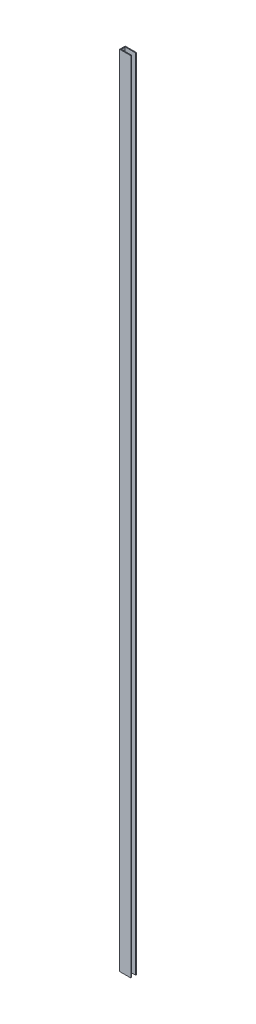
ISO-10303-21;
HEADER;
FILE_DESCRIPTION(('STEP AP214'),'2;1');
FILE_NAME('part.step','',(''),(''),'','','');
FILE_SCHEMA(('AUTOMOTIVE_DESIGN { 1 0 10303 214 1 1 1 1 }'));
ENDSEC;
DATA;
#1=APPLICATION_CONTEXT('core data for automotive mechanical design processes');
#2=APPLICATION_PROTOCOL_DEFINITION('international standard','automotive_design',2000,#1);
#3=PRODUCT_CONTEXT('',#1,'mechanical');
#4=PRODUCT('Part','Part','',(#3));
#5=PRODUCT_RELATED_PRODUCT_CATEGORY('part','',(#4));
#6=PRODUCT_DEFINITION_FORMATION('','',#4);
#7=PRODUCT_DEFINITION_CONTEXT('part definition',#1,'design');
#8=PRODUCT_DEFINITION('design','',#6,#7);
#9=PRODUCT_DEFINITION_SHAPE('','',#8);
#10=(LENGTH_UNIT() NAMED_UNIT(*) SI_UNIT(.MILLI.,.METRE.));
#11=(NAMED_UNIT(*) PLANE_ANGLE_UNIT() SI_UNIT($,.RADIAN.));
#12=(NAMED_UNIT(*) SI_UNIT($,.STERADIAN.) SOLID_ANGLE_UNIT());
#13=UNCERTAINTY_MEASURE_WITH_UNIT(LENGTH_MEASURE(1.E-05),#10,'distance_accuracy_value','');
#14=(GEOMETRIC_REPRESENTATION_CONTEXT(3) GLOBAL_UNCERTAINTY_ASSIGNED_CONTEXT((#13)) GLOBAL_UNIT_ASSIGNED_CONTEXT((#10,
#11,#12)) REPRESENTATION_CONTEXT('',''));
#15=CARTESIAN_POINT('',(0.,0.,0.));
#16=DIRECTION('',(0.,0.,1.));
#17=DIRECTION('',(1.,0.,0.));
#18=AXIS2_PLACEMENT_3D('',#15,#16,#17);
#19=CARTESIAN_POINT('',(0.,2000.,7.00000000000001));
#20=DIRECTION('',(-1.,0.,0.));
#21=DIRECTION('',(0.,0.,1.));
#22=AXIS2_PLACEMENT_3D('',#19,#20,#21);
#23=PLANE('',#22);
#24=DIRECTION('',(0.,0.,-1.));
#25=VECTOR('',#24,1.);
#26=CARTESIAN_POINT('',(0.,0.,7.00000000000001));
#27=LINE('',#26,#25);
#28=CARTESIAN_POINT('',(0.,0.,7.00000000000001));
#29=VERTEX_POINT('',#28);
#30=CARTESIAN_POINT('',(0.,0.,-7.00000000000001));
#31=VERTEX_POINT('',#30);
#32=EDGE_CURVE('E132',#29,#31,#27,.T.);
#33=ORIENTED_EDGE('',*,*,#32,.F.);
#34=DIRECTION('',(0.,-1.,0.));
#35=VECTOR('',#34,1.);
#36=CARTESIAN_POINT('',(0.,2000.,7.00000000000001));
#37=LINE('',#36,#35);
#38=CARTESIAN_POINT('',(0.,2000.,7.00000000000001));
#39=VERTEX_POINT('',#38);
#40=EDGE_CURVE('E11',#39,#29,#37,.T.);
#41=ORIENTED_EDGE('',*,*,#40,.F.);
#42=DIRECTION('',(0.,0.,-1.));
#43=VECTOR('',#42,1.);
#44=CARTESIAN_POINT('',(0.,2000.,7.00000000000001));
#45=LINE('',#44,#43);
#46=CARTESIAN_POINT('',(0.,2000.,-7.00000000000001));
#47=VERTEX_POINT('',#46);
#48=EDGE_CURVE('E152',#39,#47,#45,.T.);
#49=ORIENTED_EDGE('',*,*,#48,.T.);
#50=DIRECTION('',(0.,-1.,0.));
#51=VECTOR('',#50,1.);
#52=CARTESIAN_POINT('',(0.,2000.,-7.00000000000001));
#53=LINE('',#52,#51);
#54=EDGE_CURVE('E38',#47,#31,#53,.T.);
#55=ORIENTED_EDGE('',*,*,#54,.T.);
#56=EDGE_LOOP('',(#33,#41,#49,#55));
#57=FACE_BOUND('',#56,.T.);
#58=ADVANCED_FACE('F35',(#57),#23,.T.);
#59=CARTESIAN_POINT('',(28.,2000.,7.));
#60=DIRECTION('',(0.,0.,1.));
#61=DIRECTION('',(1.,0.,0.));
#62=AXIS2_PLACEMENT_3D('',#59,#60,#61);
#63=PLANE('',#62);
#64=DIRECTION('',(-1.,0.,0.));
#65=VECTOR('',#64,1.);
#66=CARTESIAN_POINT('',(28.,0.,7.));
#67=LINE('',#66,#65);
#68=CARTESIAN_POINT('',(28.,0.,7.));
#69=VERTEX_POINT('',#68);
#70=EDGE_CURVE('E150',#69,#29,#67,.T.);
#71=ORIENTED_EDGE('',*,*,#70,.F.);
#72=DIRECTION('',(0.,-1.,0.));
#73=VECTOR('',#72,1.);
#74=CARTESIAN_POINT('',(28.,2000.,7.));
#75=LINE('',#74,#73);
#76=CARTESIAN_POINT('',(28.,2000.,7.));
#77=VERTEX_POINT('',#76);
#78=EDGE_CURVE('E44',#77,#69,#75,.T.);
#79=ORIENTED_EDGE('',*,*,#78,.F.);
#80=DIRECTION('',(-1.,0.,0.));
#81=VECTOR('',#80,1.);
#82=CARTESIAN_POINT('',(28.,2000.,7.));
#83=LINE('',#82,#81);
#84=EDGE_CURVE('E122',#77,#39,#83,.T.);
#85=ORIENTED_EDGE('',*,*,#84,.T.);
#86=ORIENTED_EDGE('',*,*,#40,.T.);
#87=EDGE_LOOP('',(#71,#79,#85,#86));
#88=FACE_BOUND('',#87,.T.);
#89=ADVANCED_FACE('F164',(#88),#63,.T.);
#90=CARTESIAN_POINT('',(28.,2000.,5.));
#91=DIRECTION('',(1.,0.,0.));
#92=DIRECTION('',(0.,0.,-1.));
#93=AXIS2_PLACEMENT_3D('',#90,#91,#92);
#94=PLANE('',#93);
#95=DIRECTION('',(0.,0.,1.));
#96=VECTOR('',#95,1.);
#97=CARTESIAN_POINT('',(28.,0.,5.));
#98=LINE('',#97,#96);
#99=CARTESIAN_POINT('',(28.,0.,5.));
#100=VERTEX_POINT('',#99);
#101=EDGE_CURVE('E109',#100,#69,#98,.T.);
#102=ORIENTED_EDGE('',*,*,#101,.F.);
#103=DIRECTION('',(0.,-1.,0.));
#104=VECTOR('',#103,1.);
#105=CARTESIAN_POINT('',(28.,2000.,5.));
#106=LINE('',#105,#104);
#107=CARTESIAN_POINT('',(28.,2000.,5.));
#108=VERTEX_POINT('',#107);
#109=EDGE_CURVE('E104',#108,#100,#106,.T.);
#110=ORIENTED_EDGE('',*,*,#109,.F.);
#111=DIRECTION('',(0.,0.,1.));
#112=VECTOR('',#111,1.);
#113=CARTESIAN_POINT('',(28.,2000.,5.));
#114=LINE('',#113,#112);
#115=EDGE_CURVE('E107',#108,#77,#114,.T.);
#116=ORIENTED_EDGE('',*,*,#115,.T.);
#117=ORIENTED_EDGE('',*,*,#78,.T.);
#118=EDGE_LOOP('',(#102,#110,#116,#117));
#119=FACE_BOUND('',#118,.T.);
#120=ADVANCED_FACE('F106',(#119),#94,.T.);
#121=CARTESIAN_POINT('',(2.,2000.,5.));
#122=DIRECTION('',(0.,0.,-1.));
#123=DIRECTION('',(-1.,0.,0.));
#124=AXIS2_PLACEMENT_3D('',#121,#122,#123);
#125=PLANE('',#124);
#126=DIRECTION('',(1.,0.,0.));
#127=VECTOR('',#126,1.);
#128=CARTESIAN_POINT('',(2.,0.,5.));
#129=LINE('',#128,#127);
#130=CARTESIAN_POINT('',(2.,0.,5.));
#131=VERTEX_POINT('',#130);
#132=EDGE_CURVE('E147',#131,#100,#129,.T.);
#133=ORIENTED_EDGE('',*,*,#132,.F.);
#134=DIRECTION('',(0.,-1.,0.));
#135=VECTOR('',#134,1.);
#136=CARTESIAN_POINT('',(2.,2000.,5.));
#137=LINE('',#136,#135);
#138=CARTESIAN_POINT('',(2.,2000.,5.));
#139=VERTEX_POINT('',#138);
#140=EDGE_CURVE('E114',#139,#131,#137,.T.);
#141=ORIENTED_EDGE('',*,*,#140,.F.);
#142=DIRECTION('',(1.,0.,0.));
#143=VECTOR('',#142,1.);
#144=CARTESIAN_POINT('',(2.,2000.,5.));
#145=LINE('',#144,#143);
#146=EDGE_CURVE('E120',#139,#108,#145,.T.);
#147=ORIENTED_EDGE('',*,*,#146,.T.);
#148=ORIENTED_EDGE('',*,*,#109,.T.);
#149=EDGE_LOOP('',(#133,#141,#147,#148));
#150=FACE_BOUND('',#149,.T.);
#151=ADVANCED_FACE('F124',(#150),#125,.T.);
#152=CARTESIAN_POINT('',(2.,2000.,-5.));
#153=DIRECTION('',(1.,0.,0.));
#154=DIRECTION('',(0.,0.,-1.));
#155=AXIS2_PLACEMENT_3D('',#152,#153,#154);
#156=PLANE('',#155);
#157=DIRECTION('',(0.,0.,1.));
#158=VECTOR('',#157,1.);
#159=CARTESIAN_POINT('',(2.,0.,-5.));
#160=LINE('',#159,#158);
#161=CARTESIAN_POINT('',(2.,0.,-5.));
#162=VERTEX_POINT('',#161);
#163=EDGE_CURVE('E144',#162,#131,#160,.T.);
#164=ORIENTED_EDGE('',*,*,#163,.F.);
#165=DIRECTION('',(0.,-1.,0.));
#166=VECTOR('',#165,1.);
#167=CARTESIAN_POINT('',(2.,2000.,-5.));
#168=LINE('',#167,#166);
#169=CARTESIAN_POINT('',(2.,2000.,-5.));
#170=VERTEX_POINT('',#169);
#171=EDGE_CURVE('E156',#170,#162,#168,.T.);
#172=ORIENTED_EDGE('',*,*,#171,.F.);
#173=DIRECTION('',(0.,0.,1.));
#174=VECTOR('',#173,1.);
#175=CARTESIAN_POINT('',(2.,2000.,-5.));
#176=LINE('',#175,#174);
#177=EDGE_CURVE('E125',#170,#139,#176,.T.);
#178=ORIENTED_EDGE('',*,*,#177,.T.);
#179=ORIENTED_EDGE('',*,*,#140,.T.);
#180=EDGE_LOOP('',(#164,#172,#178,#179));
#181=FACE_BOUND('',#180,.T.);
#182=ADVANCED_FACE('F177',(#181),#156,.T.);
#183=CARTESIAN_POINT('',(28.,2000.,-5.));
#184=DIRECTION('',(0.,0.,1.));
#185=DIRECTION('',(1.,0.,0.));
#186=AXIS2_PLACEMENT_3D('',#183,#184,#185);
#187=PLANE('',#186);
#188=DIRECTION('',(-1.,0.,0.));
#189=VECTOR('',#188,1.);
#190=CARTESIAN_POINT('',(28.,0.,-5.));
#191=LINE('',#190,#189);
#192=CARTESIAN_POINT('',(28.,0.,-5.));
#193=VERTEX_POINT('',#192);
#194=EDGE_CURVE('E141',#193,#162,#191,.T.);
#195=ORIENTED_EDGE('',*,*,#194,.F.);
#196=DIRECTION('',(0.,-1.,0.));
#197=VECTOR('',#196,1.);
#198=CARTESIAN_POINT('',(28.,2000.,-5.));
#199=LINE('',#198,#197);
#200=CARTESIAN_POINT('',(28.,2000.,-5.));
#201=VERTEX_POINT('',#200);
#202=EDGE_CURVE('E158',#201,#193,#199,.T.);
#203=ORIENTED_EDGE('',*,*,#202,.F.);
#204=DIRECTION('',(-1.,0.,0.));
#205=VECTOR('',#204,1.);
#206=CARTESIAN_POINT('',(28.,2000.,-5.));
#207=LINE('',#206,#205);
#208=EDGE_CURVE('E127',#201,#170,#207,.T.);
#209=ORIENTED_EDGE('',*,*,#208,.T.);
#210=ORIENTED_EDGE('',*,*,#171,.T.);
#211=EDGE_LOOP('',(#195,#203,#209,#210));
#212=FACE_BOUND('',#211,.T.);
#213=ADVANCED_FACE('F180',(#212),#187,.T.);
#214=CARTESIAN_POINT('',(28.,2000.,-7.));
#215=DIRECTION('',(1.,0.,0.));
#216=DIRECTION('',(0.,0.,-1.));
#217=AXIS2_PLACEMENT_3D('',#214,#215,#216);
#218=PLANE('',#217);
#219=DIRECTION('',(0.,0.,1.));
#220=VECTOR('',#219,1.);
#221=CARTESIAN_POINT('',(28.,0.,-7.));
#222=LINE('',#221,#220);
#223=CARTESIAN_POINT('',(28.,0.,-7.));
#224=VERTEX_POINT('',#223);
#225=EDGE_CURVE('E138',#224,#193,#222,.T.);
#226=ORIENTED_EDGE('',*,*,#225,.F.);
#227=DIRECTION('',(0.,-1.,0.));
#228=VECTOR('',#227,1.);
#229=CARTESIAN_POINT('',(28.,2000.,-7.));
#230=LINE('',#229,#228);
#231=CARTESIAN_POINT('',(28.,2000.,-7.));
#232=VERTEX_POINT('',#231);
#233=EDGE_CURVE('E159',#232,#224,#230,.T.);
#234=ORIENTED_EDGE('',*,*,#233,.F.);
#235=DIRECTION('',(0.,0.,1.));
#236=VECTOR('',#235,1.);
#237=CARTESIAN_POINT('',(28.,2000.,-7.));
#238=LINE('',#237,#236);
#239=EDGE_CURVE('E255',#232,#201,#238,.T.);
#240=ORIENTED_EDGE('',*,*,#239,.T.);
#241=ORIENTED_EDGE('',*,*,#202,.T.);
#242=EDGE_LOOP('',(#226,#234,#240,#241));
#243=FACE_BOUND('',#242,.T.);
#244=ADVANCED_FACE('F184',(#243),#218,.T.);
#245=CARTESIAN_POINT('',(0.,2000.,-7.00000000000001));
#246=DIRECTION('',(0.,0.,-1.));
#247=DIRECTION('',(-1.,0.,0.));
#248=AXIS2_PLACEMENT_3D('',#245,#246,#247);
#249=PLANE('',#248);
#250=DIRECTION('',(1.,0.,0.));
#251=VECTOR('',#250,1.);
#252=CARTESIAN_POINT('',(0.,0.,-7.00000000000001));
#253=LINE('',#252,#251);
#254=EDGE_CURVE('E135',#31,#224,#253,.T.);
#255=ORIENTED_EDGE('',*,*,#254,.F.);
#256=ORIENTED_EDGE('',*,*,#54,.F.);
#257=DIRECTION('',(1.,0.,0.));
#258=VECTOR('',#257,1.);
#259=CARTESIAN_POINT('',(0.,2000.,-7.00000000000001));
#260=LINE('',#259,#258);
#261=EDGE_CURVE('E256',#47,#232,#260,.T.);
#262=ORIENTED_EDGE('',*,*,#261,.T.);
#263=ORIENTED_EDGE('',*,*,#233,.T.);
#264=EDGE_LOOP('',(#255,#256,#262,#263));
#265=FACE_BOUND('',#264,.T.);
#266=ADVANCED_FACE('F161',(#265),#249,.T.);
#267=CARTESIAN_POINT('',(0.,2000.,0.));
#268=DIRECTION('',(0.,-1.,0.));
#269=DIRECTION('',(0.,0.,-1.));
#270=AXIS2_PLACEMENT_3D('',#267,#268,#269);
#271=PLANE('',#270);
#272=ORIENTED_EDGE('',*,*,#48,.F.);
#273=ORIENTED_EDGE('',*,*,#84,.F.);
#274=ORIENTED_EDGE('',*,*,#115,.F.);
#275=ORIENTED_EDGE('',*,*,#146,.F.);
#276=ORIENTED_EDGE('',*,*,#177,.F.);
#277=ORIENTED_EDGE('',*,*,#208,.F.);
#278=ORIENTED_EDGE('',*,*,#239,.F.);
#279=ORIENTED_EDGE('',*,*,#261,.F.);
#280=EDGE_LOOP('',(#272,#273,#274,#275,#276,#277,#278,#279));
#281=FACE_BOUND('',#280,.T.);
#282=ADVANCED_FACE('F118',(#281),#271,.F.);
#283=CARTESIAN_POINT('',(0.,0.,0.));
#284=DIRECTION('',(0.,-1.,0.));
#285=DIRECTION('',(0.,0.,-1.));
#286=AXIS2_PLACEMENT_3D('',#283,#284,#285);
#287=PLANE('',#286);
#288=ORIENTED_EDGE('',*,*,#32,.T.);
#289=ORIENTED_EDGE('',*,*,#254,.T.);
#290=ORIENTED_EDGE('',*,*,#225,.T.);
#291=ORIENTED_EDGE('',*,*,#194,.T.);
#292=ORIENTED_EDGE('',*,*,#163,.T.);
#293=ORIENTED_EDGE('',*,*,#132,.T.);
#294=ORIENTED_EDGE('',*,*,#101,.T.);
#295=ORIENTED_EDGE('',*,*,#70,.T.);
#296=EDGE_LOOP('',(#288,#289,#290,#291,#292,#293,#294,#295));
#297=FACE_BOUND('',#296,.T.);
#298=ADVANCED_FACE('F163',(#297),#287,.T.);
#299=CLOSED_SHELL('',(#58,#89,#120,#151,#182,#213,#244,#266,#282,#298));
#300=MANIFOLD_SOLID_BREP('B2',#299);
#301=ADVANCED_BREP_SHAPE_REPRESENTATION('',(#18,#300),#14);
#302=SHAPE_DEFINITION_REPRESENTATION(#9,#301);
ENDSEC;
END-ISO-10303-21;
